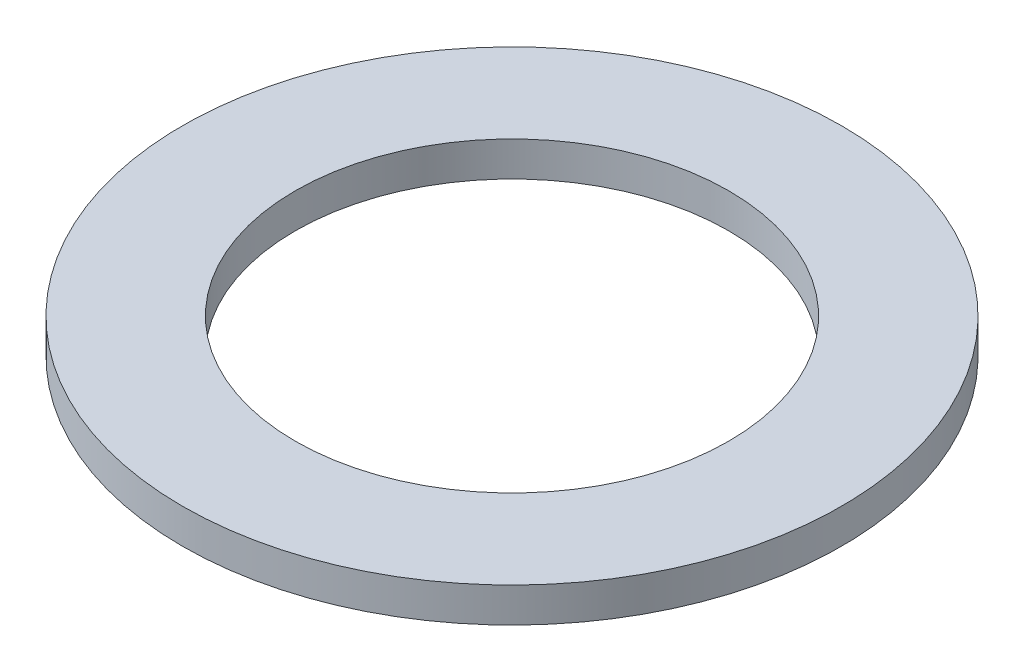
ISO-10303-21;
HEADER;
FILE_DESCRIPTION(('STEP AP214'),'2;1');
FILE_NAME('part.step','',(''),(''),'','','');
FILE_SCHEMA(('AUTOMOTIVE_DESIGN { 1 0 10303 214 1 1 1 1 }'));
ENDSEC;
DATA;
#1=APPLICATION_CONTEXT('core data for automotive mechanical design processes');
#2=APPLICATION_PROTOCOL_DEFINITION('international standard','automotive_design',2000,#1);
#3=PRODUCT_CONTEXT('',#1,'mechanical');
#4=PRODUCT('Part','Part','',(#3));
#5=PRODUCT_RELATED_PRODUCT_CATEGORY('part','',(#4));
#6=PRODUCT_DEFINITION_FORMATION('','',#4);
#7=PRODUCT_DEFINITION_CONTEXT('part definition',#1,'design');
#8=PRODUCT_DEFINITION('design','',#6,#7);
#9=PRODUCT_DEFINITION_SHAPE('','',#8);
#10=(LENGTH_UNIT() NAMED_UNIT(*) SI_UNIT(.MILLI.,.METRE.));
#11=(NAMED_UNIT(*) PLANE_ANGLE_UNIT() SI_UNIT($,.RADIAN.));
#12=(NAMED_UNIT(*) SI_UNIT($,.STERADIAN.) SOLID_ANGLE_UNIT());
#13=UNCERTAINTY_MEASURE_WITH_UNIT(LENGTH_MEASURE(1.E-05),#10,'distance_accuracy_value','');
#14=(GEOMETRIC_REPRESENTATION_CONTEXT(3) GLOBAL_UNCERTAINTY_ASSIGNED_CONTEXT((#13)) GLOBAL_UNIT_ASSIGNED_CONTEXT((#10,
#11,#12)) REPRESENTATION_CONTEXT('',''));
#15=CARTESIAN_POINT('',(0.,0.,0.));
#16=DIRECTION('',(0.,0.,1.));
#17=DIRECTION('',(1.,0.,0.));
#18=AXIS2_PLACEMENT_3D('',#15,#16,#17);
#19=CARTESIAN_POINT('',(0.,2.,0.));
#20=DIRECTION('',(0.,1.,0.));
#21=DIRECTION('',(0.,0.,1.));
#22=AXIS2_PLACEMENT_3D('',#19,#20,#21);
#23=PLANE('',#22);
#24=CARTESIAN_POINT('',(0.,2.,0.));
#25=DIRECTION('',(0.,1.,0.));
#26=DIRECTION('',(0.,0.,1.));
#27=AXIS2_PLACEMENT_3D('',#24,#25,#26);
#28=CIRCLE('',#27,19.);
#29=CARTESIAN_POINT('',(0.,2.,19.));
#30=VERTEX_POINT('',#29);
#31=EDGE_CURVE('E10',#30,#30,#28,.T.);
#32=ORIENTED_EDGE('',*,*,#31,.T.);
#33=EDGE_LOOP('',(#32));
#34=FACE_BOUND('',#33,.T.);
#35=CARTESIAN_POINT('',(0.,2.,0.));
#36=DIRECTION('',(0.,1.,0.));
#37=DIRECTION('',(0.,0.,1.));
#38=AXIS2_PLACEMENT_3D('',#35,#36,#37);
#39=CIRCLE('',#38,12.5);
#40=CARTESIAN_POINT('',(0.,2.,12.5));
#41=VERTEX_POINT('',#40);
#42=EDGE_CURVE('E42',#41,#41,#39,.T.);
#43=ORIENTED_EDGE('',*,*,#42,.F.);
#44=EDGE_LOOP('',(#43));
#45=FACE_BOUND('',#44,.T.);
#46=ADVANCED_FACE('F31',(#34,#45),#23,.T.);
#47=CARTESIAN_POINT('',(0.,0.,0.));
#48=DIRECTION('',(0.,1.,0.));
#49=DIRECTION('',(0.,0.,1.));
#50=AXIS2_PLACEMENT_3D('',#47,#48,#49);
#51=PLANE('',#50);
#52=CARTESIAN_POINT('',(0.,0.,0.));
#53=DIRECTION('',(0.,1.,0.));
#54=DIRECTION('',(0.,0.,1.));
#55=AXIS2_PLACEMENT_3D('',#52,#53,#54);
#56=CIRCLE('',#55,19.);
#57=CARTESIAN_POINT('',(0.,0.,19.));
#58=VERTEX_POINT('',#57);
#59=EDGE_CURVE('E35',#58,#58,#56,.T.);
#60=ORIENTED_EDGE('',*,*,#59,.F.);
#61=EDGE_LOOP('',(#60));
#62=FACE_BOUND('',#61,.T.);
#63=CARTESIAN_POINT('',(0.,0.,0.));
#64=DIRECTION('',(0.,1.,0.));
#65=DIRECTION('',(0.,0.,1.));
#66=AXIS2_PLACEMENT_3D('',#63,#64,#65);
#67=CIRCLE('',#66,12.5);
#68=CARTESIAN_POINT('',(0.,0.,12.5));
#69=VERTEX_POINT('',#68);
#70=EDGE_CURVE('E44',#69,#69,#67,.T.);
#71=ORIENTED_EDGE('',*,*,#70,.T.);
#72=EDGE_LOOP('',(#71));
#73=FACE_BOUND('',#72,.T.);
#74=ADVANCED_FACE('F54',(#62,#73),#51,.F.);
#75=CARTESIAN_POINT('',(0.,2.,0.));
#76=DIRECTION('',(0.,-1.,0.));
#77=DIRECTION('',(0.,0.,-1.));
#78=AXIS2_PLACEMENT_3D('',#75,#76,#77);
#79=CYLINDRICAL_SURFACE('',#78,19.);
#80=ORIENTED_EDGE('',*,*,#31,.F.);
#81=EDGE_LOOP('',(#80));
#82=FACE_BOUND('',#81,.T.);
#83=ORIENTED_EDGE('',*,*,#59,.T.);
#84=EDGE_LOOP('',(#83));
#85=FACE_BOUND('',#84,.T.);
#86=ADVANCED_FACE('F33',(#82,#85),#79,.T.);
#87=CARTESIAN_POINT('',(0.,2.,0.));
#88=DIRECTION('',(0.,-1.,0.));
#89=DIRECTION('',(0.,0.,-1.));
#90=AXIS2_PLACEMENT_3D('',#87,#88,#89);
#91=CYLINDRICAL_SURFACE('',#90,12.5);
#92=ORIENTED_EDGE('',*,*,#42,.T.);
#93=EDGE_LOOP('',(#92));
#94=FACE_BOUND('',#93,.T.);
#95=ORIENTED_EDGE('',*,*,#70,.F.);
#96=EDGE_LOOP('',(#95));
#97=FACE_BOUND('',#96,.T.);
#98=ADVANCED_FACE('F50',(#94,#97),#91,.F.);
#99=CLOSED_SHELL('',(#46,#74,#86,#98));
#100=MANIFOLD_SOLID_BREP('B2',#99);
#101=ADVANCED_BREP_SHAPE_REPRESENTATION('',(#18,#100),#14);
#102=SHAPE_DEFINITION_REPRESENTATION(#9,#101);
ENDSEC;
END-ISO-10303-21;
